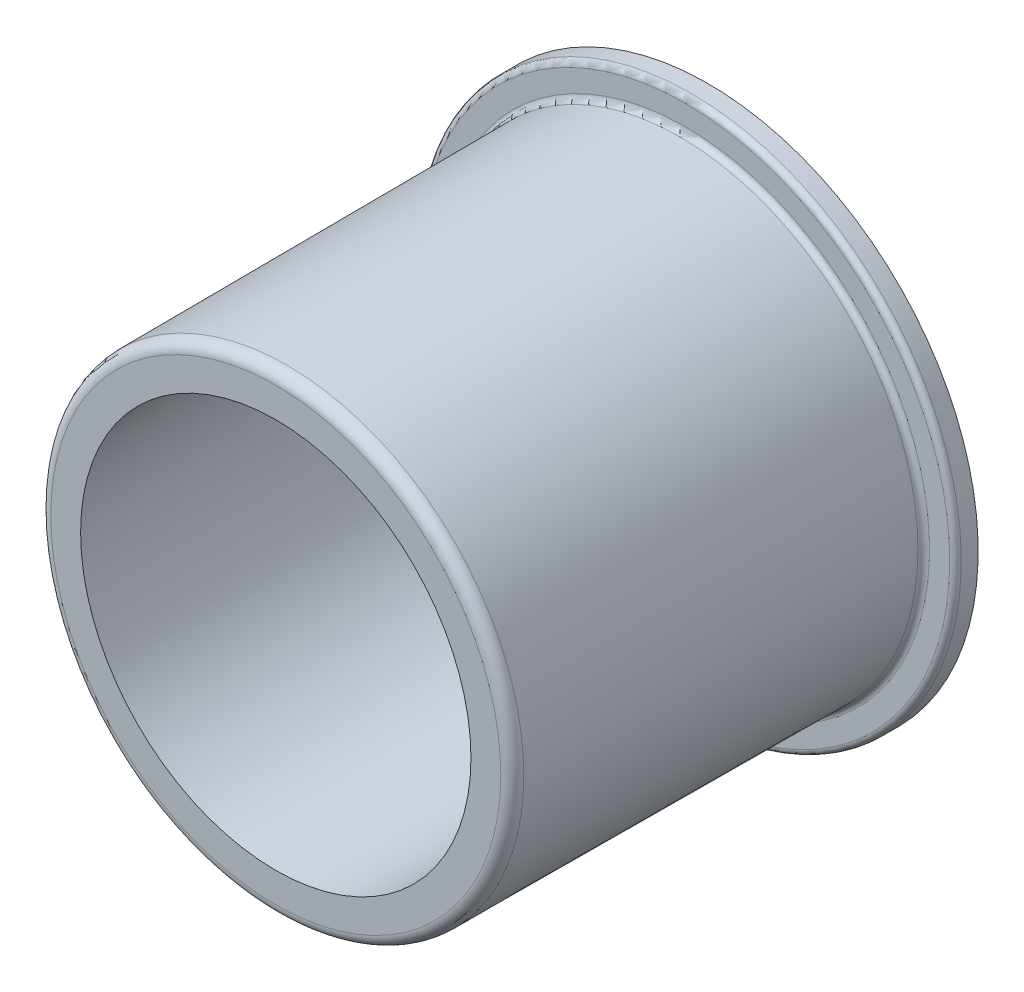
ISO-10303-21;
HEADER;
FILE_DESCRIPTION(('STEP AP214'),'2;1');
FILE_NAME('part.step','',(''),(''),'','','');
FILE_SCHEMA(('AUTOMOTIVE_DESIGN { 1 0 10303 214 1 1 1 1 }'));
ENDSEC;
DATA;
#1=APPLICATION_CONTEXT('core data for automotive mechanical design processes');
#2=APPLICATION_PROTOCOL_DEFINITION('international standard','automotive_design',2000,#1);
#3=PRODUCT_CONTEXT('',#1,'mechanical');
#4=PRODUCT('Part','Part','',(#3));
#5=PRODUCT_RELATED_PRODUCT_CATEGORY('part','',(#4));
#6=PRODUCT_DEFINITION_FORMATION('','',#4);
#7=PRODUCT_DEFINITION_CONTEXT('part definition',#1,'design');
#8=PRODUCT_DEFINITION('design','',#6,#7);
#9=PRODUCT_DEFINITION_SHAPE('','',#8);
#10=(LENGTH_UNIT() NAMED_UNIT(*) SI_UNIT(.MILLI.,.METRE.));
#11=(NAMED_UNIT(*) PLANE_ANGLE_UNIT() SI_UNIT($,.RADIAN.));
#12=(NAMED_UNIT(*) SI_UNIT($,.STERADIAN.) SOLID_ANGLE_UNIT());
#13=UNCERTAINTY_MEASURE_WITH_UNIT(LENGTH_MEASURE(1.E-05),#10,'distance_accuracy_value','');
#14=(GEOMETRIC_REPRESENTATION_CONTEXT(3) GLOBAL_UNCERTAINTY_ASSIGNED_CONTEXT((#13)) GLOBAL_UNIT_ASSIGNED_CONTEXT((#10,
#11,#12)) REPRESENTATION_CONTEXT('',''));
#15=CARTESIAN_POINT('',(0.,0.,0.));
#16=DIRECTION('',(0.,0.,1.));
#17=DIRECTION('',(1.,0.,0.));
#18=AXIS2_PLACEMENT_3D('',#15,#16,#17);
#19=CARTESIAN_POINT('',(-2.77555756156289E-13,-4.9960036108132E-13,0.5));
#20=DIRECTION('',(0.,0.,-1.));
#21=DIRECTION('',(-1.,0.,0.));
#22=AXIS2_PLACEMENT_3D('',#19,#20,#21);
#23=CONICAL_SURFACE('',#22,5.25,0.00436332312998584);
#24=CARTESIAN_POINT('',(-2.77555756156289E-13,-4.9960036108132E-13,0.626445859720826));
#25=DIRECTION('',(0.,0.,-1.));
#26=DIRECTION('',(-1.,0.,0.));
#27=AXIS2_PLACEMENT_3D('',#24,#25,#26);
#28=CIRCLE('',#27,5.24944827235421);
#29=CARTESIAN_POINT('',(-5.24944827235449,-4.9960036108132E-13,0.626445859720826));
#30=VERTEX_POINT('',#29);
#31=EDGE_CURVE('E31',#30,#30,#28,.F.);
#32=ORIENTED_EDGE('',*,*,#31,.T.);
#33=EDGE_LOOP('',(#32));
#34=FACE_BOUND('',#33,.T.);
#35=CARTESIAN_POINT('',(-2.77555756156289E-13,-4.44089209850063E-13,9.2721082805583));
#36=DIRECTION('',(0.,0.,-1.));
#37=DIRECTION('',(-1.,0.,0.));
#38=AXIS2_PLACEMENT_3D('',#35,#36,#37);
#39=CIRCLE('',#38,5.21172421413474);
#40=CARTESIAN_POINT('',(-5.21172421413502,-4.44089209850063E-13,9.2721082805583));
#41=VERTEX_POINT('',#40);
#42=EDGE_CURVE('E52',#41,#41,#39,.T.);
#43=ORIENTED_EDGE('',*,*,#42,.T.);
#44=EDGE_LOOP('',(#43));
#45=FACE_BOUND('',#44,.T.);
#46=ADVANCED_FACE('F15',(#34,#45),#23,.T.);
#47=CARTESIAN_POINT('',(-2.77555756156289E-13,-4.44089209850063E-13,9.525));
#48=DIRECTION('',(0.,0.,1.));
#49=DIRECTION('',(1.,0.,0.));
#50=AXIS2_PLACEMENT_3D('',#47,#48,#49);
#51=PLANE('',#50);
#52=CARTESIAN_POINT('',(-2.77555756156289E-13,-4.44089209850063E-13,9.525));
#53=DIRECTION('',(0.,0.,1.));
#54=DIRECTION('',(1.,0.,0.));
#55=AXIS2_PLACEMENT_3D('',#52,#53,#54);
#56=CIRCLE('',#55,4.95772663203167);
#57=CARTESIAN_POINT('',(4.95772663203139,-4.44089209850063E-13,9.525));
#58=VERTEX_POINT('',#57);
#59=EDGE_CURVE('E56',#58,#58,#56,.T.);
#60=ORIENTED_EDGE('',*,*,#59,.T.);
#61=EDGE_LOOP('',(#60));
#62=FACE_BOUND('',#61,.T.);
#63=CARTESIAN_POINT('',(-2.77555756156289E-13,-4.44089209850063E-13,9.525));
#64=DIRECTION('',(0.,0.,1.));
#65=DIRECTION('',(1.,0.,0.));
#66=AXIS2_PLACEMENT_3D('',#63,#64,#65);
#67=CIRCLE('',#66,4.3);
#68=CARTESIAN_POINT('',(4.29999999999972,-4.44089209850063E-13,9.525));
#69=VERTEX_POINT('',#68);
#70=EDGE_CURVE('E60',#69,#69,#67,.T.);
#71=ORIENTED_EDGE('',*,*,#70,.F.);
#72=EDGE_LOOP('',(#71));
#73=FACE_BOUND('',#72,.T.);
#74=ADVANCED_FACE('F90',(#62,#73),#51,.T.);
#75=CARTESIAN_POINT('',(-3.33066907387547E-13,-4.71844785465692E-13,0.));
#76=DIRECTION('',(0.,0.,1.));
#77=DIRECTION('',(1.,0.,0.));
#78=AXIS2_PLACEMENT_3D('',#75,#76,#77);
#79=PLANE('',#78);
#80=CARTESIAN_POINT('',(-3.33066907387547E-13,-4.71844785465692E-13,0.));
#81=DIRECTION('',(0.,0.,1.));
#82=DIRECTION('',(1.,0.,0.));
#83=AXIS2_PLACEMENT_3D('',#80,#81,#82);
#84=CIRCLE('',#83,4.554);
#85=CARTESIAN_POINT('',(4.55399999999967,-4.71844785465692E-13,0.));
#86=VERTEX_POINT('',#85);
#87=EDGE_CURVE('E48',#86,#86,#84,.T.);
#88=ORIENTED_EDGE('',*,*,#87,.T.);
#89=EDGE_LOOP('',(#88));
#90=FACE_BOUND('',#89,.T.);
#91=CARTESIAN_POINT('',(-3.33066907387547E-13,-4.71844785465692E-13,0.));
#92=DIRECTION('',(0.,0.,-1.));
#93=DIRECTION('',(-1.,0.,0.));
#94=AXIS2_PLACEMENT_3D('',#91,#92,#93);
#95=CIRCLE('',#94,5.95);
#96=CARTESIAN_POINT('',(-5.95000000000033,-4.71844785465692E-13,0.));
#97=VERTEX_POINT('',#96);
#98=EDGE_CURVE('E64',#97,#97,#95,.T.);
#99=ORIENTED_EDGE('',*,*,#98,.T.);
#100=EDGE_LOOP('',(#99));
#101=FACE_BOUND('',#100,.T.);
#102=ADVANCED_FACE('F70',(#90,#101),#79,.F.);
#103=CARTESIAN_POINT('',(-2.77555756156289E-13,-4.44089209850063E-13,9.525));
#104=DIRECTION('',(0.,0.,-1.));
#105=DIRECTION('',(-1.,0.,0.));
#106=AXIS2_PLACEMENT_3D('',#103,#104,#105);
#107=CYLINDRICAL_SURFACE('',#106,4.3);
#108=CARTESIAN_POINT('',(-2.77555756156289E-13,-4.9960036108132E-13,0.254000000000032));
#109=DIRECTION('',(0.,0.,1.));
#110=DIRECTION('',(1.,0.,0.));
#111=AXIS2_PLACEMENT_3D('',#108,#109,#110);
#112=CIRCLE('',#111,4.3);
#113=CARTESIAN_POINT('',(4.29999999999972,-4.9960036108132E-13,0.254000000000032));
#114=VERTEX_POINT('',#113);
#115=EDGE_CURVE('E44',#114,#114,#112,.F.);
#116=ORIENTED_EDGE('',*,*,#115,.T.);
#117=EDGE_LOOP('',(#116));
#118=FACE_BOUND('',#117,.T.);
#119=ORIENTED_EDGE('',*,*,#70,.T.);
#120=EDGE_LOOP('',(#119));
#121=FACE_BOUND('',#120,.T.);
#122=ADVANCED_FACE('F86',(#118,#121),#107,.F.);
#123=CARTESIAN_POINT('',(-2.77555756156289E-13,-4.9960036108132E-13,0.5));
#124=DIRECTION('',(0.,0.,-1.));
#125=DIRECTION('',(-1.,0.,0.));
#126=AXIS2_PLACEMENT_3D('',#123,#124,#125);
#127=PLANE('',#126);
#128=CARTESIAN_POINT('',(-2.77555756156289E-13,-4.9960036108132E-13,0.5));
#129=DIRECTION('',(0.,0.,-1.));
#130=DIRECTION('',(-1.,0.,0.));
#131=AXIS2_PLACEMENT_3D('',#128,#129,#130);
#132=CIRCLE('',#131,5.823);
#133=CARTESIAN_POINT('',(-5.82300000000028,-4.9960036108132E-13,0.5));
#134=VERTEX_POINT('',#133);
#135=EDGE_CURVE('E10',#134,#134,#132,.F.);
#136=ORIENTED_EDGE('',*,*,#135,.T.);
#137=EDGE_LOOP('',(#136));
#138=FACE_BOUND('',#137,.T.);
#139=CARTESIAN_POINT('',(-2.77555756156289E-13,-4.9960036108132E-13,0.5));
#140=DIRECTION('',(0.,0.,-1.));
#141=DIRECTION('',(-1.,0.,0.));
#142=AXIS2_PLACEMENT_3D('',#139,#140,#141);
#143=CIRCLE('',#142,5.37644706340574);
#144=CARTESIAN_POINT('',(-5.37644706340602,-4.9960036108132E-13,0.5));
#145=VERTEX_POINT('',#144);
#146=EDGE_CURVE('E39',#145,#145,#143,.T.);
#147=ORIENTED_EDGE('',*,*,#146,.T.);
#148=EDGE_LOOP('',(#147));
#149=FACE_BOUND('',#148,.T.);
#150=ADVANCED_FACE('F75',(#138,#149),#127,.F.);
#151=CARTESIAN_POINT('',(-2.77555756156289E-13,-4.9960036108132E-13,0.5));
#152=DIRECTION('',(0.,0.,-1.));
#153=DIRECTION('',(-1.,0.,0.));
#154=AXIS2_PLACEMENT_3D('',#151,#152,#153);
#155=CYLINDRICAL_SURFACE('',#154,5.95);
#156=CARTESIAN_POINT('',(-2.77555756156289E-13,-4.9960036108132E-13,0.373000000000012));
#157=DIRECTION('',(0.,0.,-1.));
#158=DIRECTION('',(-1.,0.,0.));
#159=AXIS2_PLACEMENT_3D('',#156,#157,#158);
#160=CIRCLE('',#159,5.95);
#161=CARTESIAN_POINT('',(-5.95000000000028,-4.9960036108132E-13,0.373000000000012));
#162=VERTEX_POINT('',#161);
#163=EDGE_CURVE('E22',#162,#162,#160,.T.);
#164=ORIENTED_EDGE('',*,*,#163,.T.);
#165=EDGE_LOOP('',(#164));
#166=FACE_BOUND('',#165,.T.);
#167=ORIENTED_EDGE('',*,*,#98,.F.);
#168=EDGE_LOOP('',(#167));
#169=FACE_BOUND('',#168,.T.);
#170=ADVANCED_FACE('F72',(#166,#169),#155,.T.);
#171=CARTESIAN_POINT('',(-2.77555756156289E-13,-4.44089209850063E-13,9.271));
#172=DIRECTION('',(0.,0.,1.));
#173=DIRECTION('',(1.,0.,0.));
#174=AXIS2_PLACEMENT_3D('',#171,#172,#173);
#175=TOROIDAL_SURFACE('',#174,4.95772663203167,0.254);
#176=ORIENTED_EDGE('',*,*,#42,.F.);
#177=EDGE_LOOP('',(#176));
#178=FACE_BOUND('',#177,.T.);
#179=ORIENTED_EDGE('',*,*,#59,.F.);
#180=EDGE_LOOP('',(#179));
#181=FACE_BOUND('',#180,.T.);
#182=ADVANCED_FACE('F74',(#178,#181),#175,.T.);
#183=CARTESIAN_POINT('',(-2.77555756156289E-13,-4.9960036108132E-13,0.254000000000032));
#184=DIRECTION('',(0.,0.,1.));
#185=DIRECTION('',(1.,0.,0.));
#186=AXIS2_PLACEMENT_3D('',#183,#184,#185);
#187=TOROIDAL_SURFACE('',#186,4.554,0.254);
#188=ORIENTED_EDGE('',*,*,#115,.F.);
#189=EDGE_LOOP('',(#188));
#190=FACE_BOUND('',#189,.T.);
#191=ORIENTED_EDGE('',*,*,#87,.F.);
#192=EDGE_LOOP('',(#191));
#193=FACE_BOUND('',#192,.T.);
#194=ADVANCED_FACE('F83',(#190,#193),#187,.T.);
#195=CARTESIAN_POINT('',(-2.77555756156289E-13,-4.9960036108132E-13,0.626999999999989));
#196=DIRECTION('',(0.,0.,-1.));
#197=DIRECTION('',(-1.,0.,0.));
#198=AXIS2_PLACEMENT_3D('',#195,#196,#197);
#199=TOROIDAL_SURFACE('',#198,5.37644706340574,0.127);
#200=ORIENTED_EDGE('',*,*,#31,.F.);
#201=EDGE_LOOP('',(#200));
#202=FACE_BOUND('',#201,.T.);
#203=ORIENTED_EDGE('',*,*,#146,.F.);
#204=EDGE_LOOP('',(#203));
#205=FACE_BOUND('',#204,.T.);
#206=ADVANCED_FACE('F117',(#202,#205),#199,.F.);
#207=CARTESIAN_POINT('',(-2.77555756156289E-13,-4.9960036108132E-13,0.373000000000012));
#208=DIRECTION('',(0.,0.,-1.));
#209=DIRECTION('',(-1.,0.,0.));
#210=AXIS2_PLACEMENT_3D('',#207,#208,#209);
#211=TOROIDAL_SURFACE('',#210,5.823,0.127);
#212=ORIENTED_EDGE('',*,*,#135,.F.);
#213=EDGE_LOOP('',(#212));
#214=FACE_BOUND('',#213,.T.);
#215=ORIENTED_EDGE('',*,*,#163,.F.);
#216=EDGE_LOOP('',(#215));
#217=FACE_BOUND('',#216,.T.);
#218=ADVANCED_FACE('F124',(#214,#217),#211,.T.);
#219=CLOSED_SHELL('',(#46,#74,#102,#122,#150,#170,#182,#194,#206,#218));
#220=MANIFOLD_SOLID_BREP('B1',#219);
#221=ADVANCED_BREP_SHAPE_REPRESENTATION('',(#18,#220),#14);
#222=SHAPE_DEFINITION_REPRESENTATION(#9,#221);
ENDSEC;
END-ISO-10303-21;
